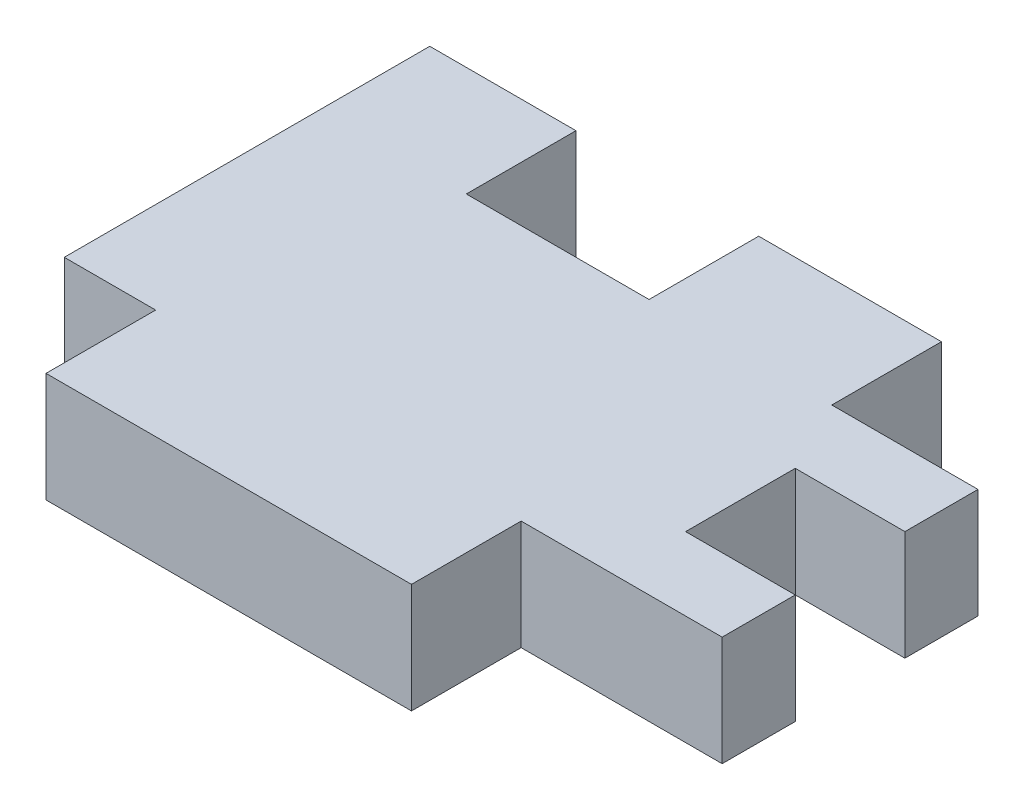
ISO-10303-21;
HEADER;
FILE_DESCRIPTION(('STEP AP214'),'2;1');
FILE_NAME('part.step','',(''),(''),'','','');
FILE_SCHEMA(('AUTOMOTIVE_DESIGN { 1 0 10303 214 1 1 1 1 }'));
ENDSEC;
DATA;
#1=APPLICATION_CONTEXT('core data for automotive mechanical design processes');
#2=APPLICATION_PROTOCOL_DEFINITION('international standard','automotive_design',2000,#1);
#3=PRODUCT_CONTEXT('',#1,'mechanical');
#4=PRODUCT('Part','Part','',(#3));
#5=PRODUCT_RELATED_PRODUCT_CATEGORY('part','',(#4));
#6=PRODUCT_DEFINITION_FORMATION('','',#4);
#7=PRODUCT_DEFINITION_CONTEXT('part definition',#1,'design');
#8=PRODUCT_DEFINITION('design','',#6,#7);
#9=PRODUCT_DEFINITION_SHAPE('','',#8);
#10=(LENGTH_UNIT() NAMED_UNIT(*) SI_UNIT(.MILLI.,.METRE.));
#11=(NAMED_UNIT(*) PLANE_ANGLE_UNIT() SI_UNIT($,.RADIAN.));
#12=(NAMED_UNIT(*) SI_UNIT($,.STERADIAN.) SOLID_ANGLE_UNIT());
#13=UNCERTAINTY_MEASURE_WITH_UNIT(LENGTH_MEASURE(1.E-05),#10,'distance_accuracy_value','');
#14=(GEOMETRIC_REPRESENTATION_CONTEXT(3) GLOBAL_UNCERTAINTY_ASSIGNED_CONTEXT((#13)) GLOBAL_UNIT_ASSIGNED_CONTEXT((#10,
#11,#12)) REPRESENTATION_CONTEXT('',''));
#15=CARTESIAN_POINT('',(0.,0.,0.));
#16=DIRECTION('',(0.,0.,1.));
#17=DIRECTION('',(1.,0.,0.));
#18=AXIS2_PLACEMENT_3D('',#15,#16,#17);
#19=CARTESIAN_POINT('',(4.,3.,0.));
#20=DIRECTION('',(-1.,0.,0.));
#21=DIRECTION('',(0.,0.,1.));
#22=AXIS2_PLACEMENT_3D('',#19,#20,#21);
#23=PLANE('',#22);
#24=DIRECTION('',(0.,0.,-1.));
#25=VECTOR('',#24,1.);
#26=CARTESIAN_POINT('',(4.,0.,0.));
#27=LINE('',#26,#25);
#28=CARTESIAN_POINT('',(4.,0.,-10.));
#29=VERTEX_POINT('',#28);
#30=CARTESIAN_POINT('',(4.,0.,-13.));
#31=VERTEX_POINT('',#30);
#32=EDGE_CURVE('E194',#29,#31,#27,.T.);
#33=ORIENTED_EDGE('',*,*,#32,.T.);
#34=DIRECTION('',(0.,-1.,0.));
#35=VECTOR('',#34,1.);
#36=CARTESIAN_POINT('',(4.,3.,-13.));
#37=LINE('',#36,#35);
#38=CARTESIAN_POINT('',(4.,3.,-13.));
#39=VERTEX_POINT('',#38);
#40=EDGE_CURVE('E11',#39,#31,#37,.T.);
#41=ORIENTED_EDGE('',*,*,#40,.F.);
#42=DIRECTION('',(0.,0.,-1.));
#43=VECTOR('',#42,1.);
#44=CARTESIAN_POINT('',(4.,3.,0.));
#45=LINE('',#44,#43);
#46=CARTESIAN_POINT('',(4.,3.,-10.));
#47=VERTEX_POINT('',#46);
#48=EDGE_CURVE('E341',#47,#39,#45,.T.);
#49=ORIENTED_EDGE('',*,*,#48,.F.);
#50=DIRECTION('',(0.,-1.,0.));
#51=VECTOR('',#50,1.);
#52=CARTESIAN_POINT('',(4.,3.,-10.));
#53=LINE('',#52,#51);
#54=EDGE_CURVE('E51',#47,#29,#53,.T.);
#55=ORIENTED_EDGE('',*,*,#54,.T.);
#56=EDGE_LOOP('',(#33,#41,#49,#55));
#57=FACE_BOUND('',#56,.T.);
#58=ADVANCED_FACE('F35',(#57),#23,.F.);
#59=CARTESIAN_POINT('',(0.,3.,-13.));
#60=DIRECTION('',(0.,0.,1.));
#61=DIRECTION('',(1.,0.,0.));
#62=AXIS2_PLACEMENT_3D('',#59,#60,#61);
#63=PLANE('',#62);
#64=DIRECTION('',(-1.,0.,0.));
#65=VECTOR('',#64,1.);
#66=CARTESIAN_POINT('',(0.,0.,-13.));
#67=LINE('',#66,#65);
#68=CARTESIAN_POINT('',(0.,0.,-13.));
#69=VERTEX_POINT('',#68);
#70=EDGE_CURVE('E196',#31,#69,#67,.T.);
#71=ORIENTED_EDGE('',*,*,#70,.T.);
#72=DIRECTION('',(0.,-1.,0.));
#73=VECTOR('',#72,1.);
#74=CARTESIAN_POINT('',(0.,3.,-13.));
#75=LINE('',#74,#73);
#76=CARTESIAN_POINT('',(0.,3.,-13.));
#77=VERTEX_POINT('',#76);
#78=EDGE_CURVE('E43',#77,#69,#75,.T.);
#79=ORIENTED_EDGE('',*,*,#78,.F.);
#80=DIRECTION('',(-1.,0.,0.));
#81=VECTOR('',#80,1.);
#82=CARTESIAN_POINT('',(0.,3.,-13.));
#83=LINE('',#82,#81);
#84=EDGE_CURVE('E120',#39,#77,#83,.T.);
#85=ORIENTED_EDGE('',*,*,#84,.F.);
#86=ORIENTED_EDGE('',*,*,#40,.T.);
#87=EDGE_LOOP('',(#71,#79,#85,#86));
#88=FACE_BOUND('',#87,.T.);
#89=ADVANCED_FACE('F335',(#88),#63,.F.);
#90=CARTESIAN_POINT('',(0.,3.,0.));
#91=DIRECTION('',(1.,0.,0.));
#92=DIRECTION('',(0.,0.,-1.));
#93=AXIS2_PLACEMENT_3D('',#90,#91,#92);
#94=PLANE('',#93);
#95=DIRECTION('',(0.,0.,1.));
#96=VECTOR('',#95,1.);
#97=CARTESIAN_POINT('',(0.,0.,0.));
#98=LINE('',#97,#96);
#99=CARTESIAN_POINT('',(0.,0.,-3.));
#100=VERTEX_POINT('',#99);
#101=EDGE_CURVE('E198',#69,#100,#98,.T.);
#102=ORIENTED_EDGE('',*,*,#101,.T.);
#103=DIRECTION('',(0.,-1.,0.));
#104=VECTOR('',#103,1.);
#105=CARTESIAN_POINT('',(0.,3.,-3.));
#106=LINE('',#105,#104);
#107=CARTESIAN_POINT('',(0.,3.,-3.));
#108=VERTEX_POINT('',#107);
#109=EDGE_CURVE('E265',#108,#100,#106,.T.);
#110=ORIENTED_EDGE('',*,*,#109,.F.);
#111=DIRECTION('',(0.,0.,1.));
#112=VECTOR('',#111,1.);
#113=CARTESIAN_POINT('',(0.,3.,0.));
#114=LINE('',#113,#112);
#115=EDGE_CURVE('E272',#77,#108,#114,.T.);
#116=ORIENTED_EDGE('',*,*,#115,.F.);
#117=ORIENTED_EDGE('',*,*,#78,.T.);
#118=EDGE_LOOP('',(#102,#110,#116,#117));
#119=FACE_BOUND('',#118,.T.);
#120=ADVANCED_FACE('F270',(#119),#94,.F.);
#121=CARTESIAN_POINT('',(0.,3.,-3.));
#122=DIRECTION('',(0.,0.,1.));
#123=DIRECTION('',(1.,0.,0.));
#124=AXIS2_PLACEMENT_3D('',#121,#122,#123);
#125=PLANE('',#124);
#126=DIRECTION('',(-1.,0.,0.));
#127=VECTOR('',#126,1.);
#128=CARTESIAN_POINT('',(0.,0.,-3.));
#129=LINE('',#128,#127);
#130=CARTESIAN_POINT('',(2.5,0.,-3.));
#131=VERTEX_POINT('',#130);
#132=EDGE_CURVE('E201',#131,#100,#129,.T.);
#133=ORIENTED_EDGE('',*,*,#132,.F.);
#134=DIRECTION('',(0.,-1.,0.));
#135=VECTOR('',#134,1.);
#136=CARTESIAN_POINT('',(2.5,3.,-3.));
#137=LINE('',#136,#135);
#138=CARTESIAN_POINT('',(2.5,3.,-3.));
#139=VERTEX_POINT('',#138);
#140=EDGE_CURVE('E263',#139,#131,#137,.T.);
#141=ORIENTED_EDGE('',*,*,#140,.F.);
#142=DIRECTION('',(-1.,0.,0.));
#143=VECTOR('',#142,1.);
#144=CARTESIAN_POINT('',(0.,3.,-3.));
#145=LINE('',#144,#143);
#146=EDGE_CURVE('E282',#139,#108,#145,.T.);
#147=ORIENTED_EDGE('',*,*,#146,.T.);
#148=ORIENTED_EDGE('',*,*,#109,.T.);
#149=EDGE_LOOP('',(#133,#141,#147,#148));
#150=FACE_BOUND('',#149,.T.);
#151=ADVANCED_FACE('F279',(#150),#125,.T.);
#152=CARTESIAN_POINT('',(2.5,3.,0.));
#153=DIRECTION('',(-1.,0.,0.));
#154=DIRECTION('',(0.,0.,1.));
#155=AXIS2_PLACEMENT_3D('',#152,#153,#154);
#156=PLANE('',#155);
#157=DIRECTION('',(0.,0.,-1.));
#158=VECTOR('',#157,1.);
#159=CARTESIAN_POINT('',(2.5,0.,0.));
#160=LINE('',#159,#158);
#161=CARTESIAN_POINT('',(2.5,0.,0.));
#162=VERTEX_POINT('',#161);
#163=EDGE_CURVE('E204',#162,#131,#160,.T.);
#164=ORIENTED_EDGE('',*,*,#163,.F.);
#165=DIRECTION('',(0.,-1.,0.));
#166=VECTOR('',#165,1.);
#167=CARTESIAN_POINT('',(2.5,3.,0.));
#168=LINE('',#167,#166);
#169=CARTESIAN_POINT('',(2.5,3.,0.));
#170=VERTEX_POINT('',#169);
#171=EDGE_CURVE('E261',#170,#162,#168,.T.);
#172=ORIENTED_EDGE('',*,*,#171,.F.);
#173=DIRECTION('',(0.,0.,-1.));
#174=VECTOR('',#173,1.);
#175=CARTESIAN_POINT('',(2.5,3.,0.));
#176=LINE('',#175,#174);
#177=EDGE_CURVE('E285',#170,#139,#176,.T.);
#178=ORIENTED_EDGE('',*,*,#177,.T.);
#179=ORIENTED_EDGE('',*,*,#140,.T.);
#180=EDGE_LOOP('',(#164,#172,#178,#179));
#181=FACE_BOUND('',#180,.T.);
#182=ADVANCED_FACE('F468',(#181),#156,.T.);
#183=CARTESIAN_POINT('',(0.,3.,0.));
#184=DIRECTION('',(0.,0.,-1.));
#185=DIRECTION('',(-1.,0.,0.));
#186=AXIS2_PLACEMENT_3D('',#183,#184,#185);
#187=PLANE('',#186);
#188=DIRECTION('',(1.,0.,0.));
#189=VECTOR('',#188,1.);
#190=CARTESIAN_POINT('',(0.,0.,0.));
#191=LINE('',#190,#189);
#192=CARTESIAN_POINT('',(12.5,0.,0.));
#193=VERTEX_POINT('',#192);
#194=EDGE_CURVE('E207',#162,#193,#191,.T.);
#195=ORIENTED_EDGE('',*,*,#194,.T.);
#196=DIRECTION('',(0.,-1.,0.));
#197=VECTOR('',#196,1.);
#198=CARTESIAN_POINT('',(12.5,3.,0.));
#199=LINE('',#198,#197);
#200=CARTESIAN_POINT('',(12.5,3.,0.));
#201=VERTEX_POINT('',#200);
#202=EDGE_CURVE('E258',#201,#193,#199,.T.);
#203=ORIENTED_EDGE('',*,*,#202,.F.);
#204=DIRECTION('',(1.,0.,0.));
#205=VECTOR('',#204,1.);
#206=CARTESIAN_POINT('',(0.,3.,0.));
#207=LINE('',#206,#205);
#208=EDGE_CURVE('E287',#170,#201,#207,.T.);
#209=ORIENTED_EDGE('',*,*,#208,.F.);
#210=ORIENTED_EDGE('',*,*,#171,.T.);
#211=EDGE_LOOP('',(#195,#203,#209,#210));
#212=FACE_BOUND('',#211,.T.);
#213=ADVANCED_FACE('F458',(#212),#187,.F.);
#214=CARTESIAN_POINT('',(12.5,3.,0.));
#215=DIRECTION('',(-1.,0.,0.));
#216=DIRECTION('',(0.,0.,1.));
#217=AXIS2_PLACEMENT_3D('',#214,#215,#216);
#218=PLANE('',#217);
#219=DIRECTION('',(0.,0.,-1.));
#220=VECTOR('',#219,1.);
#221=CARTESIAN_POINT('',(12.5,0.,0.));
#222=LINE('',#221,#220);
#223=CARTESIAN_POINT('',(12.5,0.,-3.));
#224=VERTEX_POINT('',#223);
#225=EDGE_CURVE('E209',#193,#224,#222,.T.);
#226=ORIENTED_EDGE('',*,*,#225,.T.);
#227=DIRECTION('',(0.,-1.,0.));
#228=VECTOR('',#227,1.);
#229=CARTESIAN_POINT('',(12.5,3.,-3.));
#230=LINE('',#229,#228);
#231=CARTESIAN_POINT('',(12.5,3.,-3.));
#232=VERTEX_POINT('',#231);
#233=EDGE_CURVE('E255',#232,#224,#230,.T.);
#234=ORIENTED_EDGE('',*,*,#233,.F.);
#235=DIRECTION('',(0.,0.,-1.));
#236=VECTOR('',#235,1.);
#237=CARTESIAN_POINT('',(12.5,3.,0.));
#238=LINE('',#237,#236);
#239=EDGE_CURVE('E293',#201,#232,#238,.T.);
#240=ORIENTED_EDGE('',*,*,#239,.F.);
#241=ORIENTED_EDGE('',*,*,#202,.T.);
#242=EDGE_LOOP('',(#226,#234,#240,#241));
#243=FACE_BOUND('',#242,.T.);
#244=ADVANCED_FACE('F448',(#243),#218,.F.);
#245=CARTESIAN_POINT('',(0.,3.,-3.));
#246=DIRECTION('',(0.,0.,-1.));
#247=DIRECTION('',(-1.,0.,0.));
#248=AXIS2_PLACEMENT_3D('',#245,#246,#247);
#249=PLANE('',#248);
#250=DIRECTION('',(1.,0.,0.));
#251=VECTOR('',#250,1.);
#252=CARTESIAN_POINT('',(0.,0.,-3.));
#253=LINE('',#252,#251);
#254=CARTESIAN_POINT('',(18.,0.,-3.));
#255=VERTEX_POINT('',#254);
#256=EDGE_CURVE('E211',#224,#255,#253,.T.);
#257=ORIENTED_EDGE('',*,*,#256,.T.);
#258=DIRECTION('',(0.,-1.,0.));
#259=VECTOR('',#258,1.);
#260=CARTESIAN_POINT('',(18.,3.,-3.));
#261=LINE('',#260,#259);
#262=CARTESIAN_POINT('',(18.,3.,-3.));
#263=VERTEX_POINT('',#262);
#264=EDGE_CURVE('E252',#263,#255,#261,.T.);
#265=ORIENTED_EDGE('',*,*,#264,.F.);
#266=DIRECTION('',(1.,0.,0.));
#267=VECTOR('',#266,1.);
#268=CARTESIAN_POINT('',(0.,3.,-3.));
#269=LINE('',#268,#267);
#270=EDGE_CURVE('E295',#232,#263,#269,.T.);
#271=ORIENTED_EDGE('',*,*,#270,.F.);
#272=ORIENTED_EDGE('',*,*,#233,.T.);
#273=EDGE_LOOP('',(#257,#265,#271,#272));
#274=FACE_BOUND('',#273,.T.);
#275=ADVANCED_FACE('F438',(#274),#249,.F.);
#276=CARTESIAN_POINT('',(18.,3.,0.));
#277=DIRECTION('',(-1.,0.,0.));
#278=DIRECTION('',(0.,0.,1.));
#279=AXIS2_PLACEMENT_3D('',#276,#277,#278);
#280=PLANE('',#279);
#281=DIRECTION('',(0.,0.,-1.));
#282=VECTOR('',#281,1.);
#283=CARTESIAN_POINT('',(18.,0.,0.));
#284=LINE('',#283,#282);
#285=CARTESIAN_POINT('',(18.,0.,-5.));
#286=VERTEX_POINT('',#285);
#287=EDGE_CURVE('E213',#255,#286,#284,.T.);
#288=ORIENTED_EDGE('',*,*,#287,.T.);
#289=DIRECTION('',(0.,-1.,0.));
#290=VECTOR('',#289,1.);
#291=CARTESIAN_POINT('',(18.,3.,-5.));
#292=LINE('',#291,#290);
#293=CARTESIAN_POINT('',(18.,3.,-5.));
#294=VERTEX_POINT('',#293);
#295=EDGE_CURVE('E250',#294,#286,#292,.T.);
#296=ORIENTED_EDGE('',*,*,#295,.F.);
#297=DIRECTION('',(0.,0.,-1.));
#298=VECTOR('',#297,1.);
#299=CARTESIAN_POINT('',(18.,3.,0.));
#300=LINE('',#299,#298);
#301=EDGE_CURVE('E297',#263,#294,#300,.T.);
#302=ORIENTED_EDGE('',*,*,#301,.F.);
#303=ORIENTED_EDGE('',*,*,#264,.T.);
#304=EDGE_LOOP('',(#288,#296,#302,#303));
#305=FACE_BOUND('',#304,.T.);
#306=ADVANCED_FACE('F428',(#305),#280,.F.);
#307=CARTESIAN_POINT('',(0.,3.,-5.));
#308=DIRECTION('',(0.,0.,-1.));
#309=DIRECTION('',(-1.,0.,0.));
#310=AXIS2_PLACEMENT_3D('',#307,#308,#309);
#311=PLANE('',#310);
#312=DIRECTION('',(1.,0.,0.));
#313=VECTOR('',#312,1.);
#314=CARTESIAN_POINT('',(0.,0.,-5.));
#315=LINE('',#314,#313);
#316=CARTESIAN_POINT('',(15.,0.,-5.));
#317=VERTEX_POINT('',#316);
#318=EDGE_CURVE('E216',#317,#286,#315,.T.);
#319=ORIENTED_EDGE('',*,*,#318,.F.);
#320=DIRECTION('',(0.,-1.,0.));
#321=VECTOR('',#320,1.);
#322=CARTESIAN_POINT('',(15.,3.,-5.));
#323=LINE('',#322,#321);
#324=CARTESIAN_POINT('',(15.,3.,-5.));
#325=VERTEX_POINT('',#324);
#326=EDGE_CURVE('E248',#325,#317,#323,.T.);
#327=ORIENTED_EDGE('',*,*,#326,.F.);
#328=DIRECTION('',(1.,0.,0.));
#329=VECTOR('',#328,1.);
#330=CARTESIAN_POINT('',(0.,3.,-5.));
#331=LINE('',#330,#329);
#332=EDGE_CURVE('E299',#325,#294,#331,.T.);
#333=ORIENTED_EDGE('',*,*,#332,.T.);
#334=ORIENTED_EDGE('',*,*,#295,.T.);
#335=EDGE_LOOP('',(#319,#327,#333,#334));
#336=FACE_BOUND('',#335,.T.);
#337=ADVANCED_FACE('F417',(#336),#311,.T.);
#338=CARTESIAN_POINT('',(15.,3.,0.));
#339=DIRECTION('',(1.,0.,0.));
#340=DIRECTION('',(0.,0.,-1.));
#341=AXIS2_PLACEMENT_3D('',#338,#339,#340);
#342=PLANE('',#341);
#343=DIRECTION('',(0.,0.,1.));
#344=VECTOR('',#343,1.);
#345=CARTESIAN_POINT('',(15.,0.,0.));
#346=LINE('',#345,#344);
#347=CARTESIAN_POINT('',(15.,0.,-8.));
#348=VERTEX_POINT('',#347);
#349=EDGE_CURVE('E219',#348,#317,#346,.T.);
#350=ORIENTED_EDGE('',*,*,#349,.F.);
#351=DIRECTION('',(0.,-1.,0.));
#352=VECTOR('',#351,1.);
#353=CARTESIAN_POINT('',(15.,3.,-8.));
#354=LINE('',#353,#352);
#355=CARTESIAN_POINT('',(15.,3.,-8.));
#356=VERTEX_POINT('',#355);
#357=EDGE_CURVE('E246',#356,#348,#354,.T.);
#358=ORIENTED_EDGE('',*,*,#357,.F.);
#359=DIRECTION('',(0.,0.,1.));
#360=VECTOR('',#359,1.);
#361=CARTESIAN_POINT('',(15.,3.,0.));
#362=LINE('',#361,#360);
#363=EDGE_CURVE('E302',#356,#325,#362,.T.);
#364=ORIENTED_EDGE('',*,*,#363,.T.);
#365=ORIENTED_EDGE('',*,*,#326,.T.);
#366=EDGE_LOOP('',(#350,#358,#364,#365));
#367=FACE_BOUND('',#366,.T.);
#368=ADVANCED_FACE('F407',(#367),#342,.T.);
#369=CARTESIAN_POINT('',(0.,3.,-8.00000000000001));
#370=DIRECTION('',(0.,0.,-1.));
#371=DIRECTION('',(-1.,0.,0.));
#372=AXIS2_PLACEMENT_3D('',#369,#370,#371);
#373=PLANE('',#372);
#374=DIRECTION('',(1.,0.,0.));
#375=VECTOR('',#374,1.);
#376=CARTESIAN_POINT('',(0.,0.,-8.00000000000001));
#377=LINE('',#376,#375);
#378=CARTESIAN_POINT('',(18.,0.,-8.));
#379=VERTEX_POINT('',#378);
#380=EDGE_CURVE('E222',#348,#379,#377,.T.);
#381=ORIENTED_EDGE('',*,*,#380,.T.);
#382=DIRECTION('',(0.,-1.,0.));
#383=VECTOR('',#382,1.);
#384=CARTESIAN_POINT('',(18.,3.,-8.));
#385=LINE('',#384,#383);
#386=CARTESIAN_POINT('',(18.,3.,-8.));
#387=VERTEX_POINT('',#386);
#388=EDGE_CURVE('E243',#387,#379,#385,.T.);
#389=ORIENTED_EDGE('',*,*,#388,.F.);
#390=DIRECTION('',(1.,0.,0.));
#391=VECTOR('',#390,1.);
#392=CARTESIAN_POINT('',(0.,3.,-8.00000000000001));
#393=LINE('',#392,#391);
#394=EDGE_CURVE('E305',#356,#387,#393,.T.);
#395=ORIENTED_EDGE('',*,*,#394,.F.);
#396=ORIENTED_EDGE('',*,*,#357,.T.);
#397=EDGE_LOOP('',(#381,#389,#395,#396));
#398=FACE_BOUND('',#397,.T.);
#399=ADVANCED_FACE('F398',(#398),#373,.F.);
#400=CARTESIAN_POINT('',(18.,3.,0.));
#401=DIRECTION('',(-1.,0.,0.));
#402=DIRECTION('',(0.,0.,1.));
#403=AXIS2_PLACEMENT_3D('',#400,#401,#402);
#404=PLANE('',#403);
#405=DIRECTION('',(0.,0.,-1.));
#406=VECTOR('',#405,1.);
#407=CARTESIAN_POINT('',(18.,0.,0.));
#408=LINE('',#407,#406);
#409=CARTESIAN_POINT('',(18.,0.,-10.));
#410=VERTEX_POINT('',#409);
#411=EDGE_CURVE('E224',#379,#410,#408,.T.);
#412=ORIENTED_EDGE('',*,*,#411,.T.);
#413=DIRECTION('',(0.,-1.,0.));
#414=VECTOR('',#413,1.);
#415=CARTESIAN_POINT('',(18.,3.,-10.));
#416=LINE('',#415,#414);
#417=CARTESIAN_POINT('',(18.,3.,-10.));
#418=VERTEX_POINT('',#417);
#419=EDGE_CURVE('E241',#418,#410,#416,.T.);
#420=ORIENTED_EDGE('',*,*,#419,.F.);
#421=DIRECTION('',(0.,0.,-1.));
#422=VECTOR('',#421,1.);
#423=CARTESIAN_POINT('',(18.,3.,0.));
#424=LINE('',#423,#422);
#425=EDGE_CURVE('E307',#387,#418,#424,.T.);
#426=ORIENTED_EDGE('',*,*,#425,.F.);
#427=ORIENTED_EDGE('',*,*,#388,.T.);
#428=EDGE_LOOP('',(#412,#420,#426,#427));
#429=FACE_BOUND('',#428,.T.);
#430=ADVANCED_FACE('F318',(#429),#404,.F.);
#431=CARTESIAN_POINT('',(0.,3.,-10.));
#432=DIRECTION('',(0.,0.,-1.));
#433=DIRECTION('',(-1.,0.,0.));
#434=AXIS2_PLACEMENT_3D('',#431,#432,#433);
#435=PLANE('',#434);
#436=DIRECTION('',(1.,0.,0.));
#437=VECTOR('',#436,1.);
#438=CARTESIAN_POINT('',(0.,0.,-10.));
#439=LINE('',#438,#437);
#440=CARTESIAN_POINT('',(14.,0.,-10.));
#441=VERTEX_POINT('',#440);
#442=EDGE_CURVE('E227',#441,#410,#439,.T.);
#443=ORIENTED_EDGE('',*,*,#442,.F.);
#444=DIRECTION('',(0.,-1.,0.));
#445=VECTOR('',#444,1.);
#446=CARTESIAN_POINT('',(14.,3.,-10.));
#447=LINE('',#446,#445);
#448=CARTESIAN_POINT('',(14.,3.,-10.));
#449=VERTEX_POINT('',#448);
#450=EDGE_CURVE('E239',#449,#441,#447,.T.);
#451=ORIENTED_EDGE('',*,*,#450,.F.);
#452=DIRECTION('',(1.,0.,0.));
#453=VECTOR('',#452,1.);
#454=CARTESIAN_POINT('',(0.,3.,-10.));
#455=LINE('',#454,#453);
#456=EDGE_CURVE('E191',#449,#418,#455,.T.);
#457=ORIENTED_EDGE('',*,*,#456,.T.);
#458=ORIENTED_EDGE('',*,*,#419,.T.);
#459=EDGE_LOOP('',(#443,#451,#457,#458));
#460=FACE_BOUND('',#459,.T.);
#461=ADVANCED_FACE('F311',(#460),#435,.T.);
#462=CARTESIAN_POINT('',(14.,3.,0.));
#463=DIRECTION('',(-1.,0.,0.));
#464=DIRECTION('',(0.,0.,1.));
#465=AXIS2_PLACEMENT_3D('',#462,#463,#464);
#466=PLANE('',#465);
#467=DIRECTION('',(0.,0.,-1.));
#468=VECTOR('',#467,1.);
#469=CARTESIAN_POINT('',(14.,0.,0.));
#470=LINE('',#469,#468);
#471=CARTESIAN_POINT('',(14.,0.,-13.));
#472=VERTEX_POINT('',#471);
#473=EDGE_CURVE('E230',#441,#472,#470,.T.);
#474=ORIENTED_EDGE('',*,*,#473,.T.);
#475=DIRECTION('',(0.,-1.,0.));
#476=VECTOR('',#475,1.);
#477=CARTESIAN_POINT('',(14.,3.,-13.));
#478=LINE('',#477,#476);
#479=CARTESIAN_POINT('',(14.,3.,-13.));
#480=VERTEX_POINT('',#479);
#481=EDGE_CURVE('E185',#480,#472,#478,.T.);
#482=ORIENTED_EDGE('',*,*,#481,.F.);
#483=DIRECTION('',(0.,0.,-1.));
#484=VECTOR('',#483,1.);
#485=CARTESIAN_POINT('',(14.,3.,0.));
#486=LINE('',#485,#484);
#487=EDGE_CURVE('E173',#449,#480,#486,.T.);
#488=ORIENTED_EDGE('',*,*,#487,.F.);
#489=ORIENTED_EDGE('',*,*,#450,.T.);
#490=EDGE_LOOP('',(#474,#482,#488,#489));
#491=FACE_BOUND('',#490,.T.);
#492=ADVANCED_FACE('F323',(#491),#466,.F.);
#493=CARTESIAN_POINT('',(0.,3.,-13.));
#494=DIRECTION('',(0.,0.,1.));
#495=DIRECTION('',(1.,0.,0.));
#496=AXIS2_PLACEMENT_3D('',#493,#494,#495);
#497=PLANE('',#496);
#498=DIRECTION('',(-1.,0.,0.));
#499=VECTOR('',#498,1.);
#500=CARTESIAN_POINT('',(0.,0.,-13.));
#501=LINE('',#500,#499);
#502=CARTESIAN_POINT('',(9.,0.,-13.));
#503=VERTEX_POINT('',#502);
#504=EDGE_CURVE('E182',#472,#503,#501,.T.);
#505=ORIENTED_EDGE('',*,*,#504,.T.);
#506=DIRECTION('',(0.,-1.,0.));
#507=VECTOR('',#506,1.);
#508=CARTESIAN_POINT('',(9.,3.,-13.));
#509=LINE('',#508,#507);
#510=CARTESIAN_POINT('',(9.,3.,-13.));
#511=VERTEX_POINT('',#510);
#512=EDGE_CURVE('E179',#511,#503,#509,.T.);
#513=ORIENTED_EDGE('',*,*,#512,.F.);
#514=DIRECTION('',(-1.,0.,0.));
#515=VECTOR('',#514,1.);
#516=CARTESIAN_POINT('',(0.,3.,-13.));
#517=LINE('',#516,#515);
#518=EDGE_CURVE('E165',#480,#511,#517,.T.);
#519=ORIENTED_EDGE('',*,*,#518,.F.);
#520=ORIENTED_EDGE('',*,*,#481,.T.);
#521=EDGE_LOOP('',(#505,#513,#519,#520));
#522=FACE_BOUND('',#521,.T.);
#523=ADVANCED_FACE('F180',(#522),#497,.F.);
#524=CARTESIAN_POINT('',(9.,3.,0.));
#525=DIRECTION('',(1.,0.,0.));
#526=DIRECTION('',(0.,0.,-1.));
#527=AXIS2_PLACEMENT_3D('',#524,#525,#526);
#528=PLANE('',#527);
#529=DIRECTION('',(0.,0.,1.));
#530=VECTOR('',#529,1.);
#531=CARTESIAN_POINT('',(9.,0.,0.));
#532=LINE('',#531,#530);
#533=CARTESIAN_POINT('',(9.,0.,-10.));
#534=VERTEX_POINT('',#533);
#535=EDGE_CURVE('E234',#503,#534,#532,.T.);
#536=ORIENTED_EDGE('',*,*,#535,.T.);
#537=DIRECTION('',(0.,-1.,0.));
#538=VECTOR('',#537,1.);
#539=CARTESIAN_POINT('',(9.,3.,-10.));
#540=LINE('',#539,#538);
#541=CARTESIAN_POINT('',(9.,3.,-10.));
#542=VERTEX_POINT('',#541);
#543=EDGE_CURVE('E108',#542,#534,#540,.T.);
#544=ORIENTED_EDGE('',*,*,#543,.F.);
#545=DIRECTION('',(0.,0.,1.));
#546=VECTOR('',#545,1.);
#547=CARTESIAN_POINT('',(9.,3.,0.));
#548=LINE('',#547,#546);
#549=EDGE_CURVE('E170',#511,#542,#548,.T.);
#550=ORIENTED_EDGE('',*,*,#549,.F.);
#551=ORIENTED_EDGE('',*,*,#512,.T.);
#552=EDGE_LOOP('',(#536,#544,#550,#551));
#553=FACE_BOUND('',#552,.T.);
#554=ADVANCED_FACE('F187',(#553),#528,.F.);
#555=EDGE_CURVE('E231',#29,#534,#439,.T.);
#556=ORIENTED_EDGE('',*,*,#555,.F.);
#557=ORIENTED_EDGE('',*,*,#54,.F.);
#558=EDGE_CURVE('E188',#47,#542,#455,.T.);
#559=ORIENTED_EDGE('',*,*,#558,.T.);
#560=ORIENTED_EDGE('',*,*,#543,.T.);
#561=EDGE_LOOP('',(#556,#557,#559,#560));
#562=FACE_BOUND('',#561,.T.);
#563=ADVANCED_FACE('F332',(#562),#435,.T.);
#564=CARTESIAN_POINT('',(0.,3.,0.));
#565=DIRECTION('',(0.,1.,0.));
#566=DIRECTION('',(0.,0.,1.));
#567=AXIS2_PLACEMENT_3D('',#564,#565,#566);
#568=PLANE('',#567);
#569=ORIENTED_EDGE('',*,*,#48,.T.);
#570=ORIENTED_EDGE('',*,*,#84,.T.);
#571=ORIENTED_EDGE('',*,*,#115,.T.);
#572=ORIENTED_EDGE('',*,*,#146,.F.);
#573=ORIENTED_EDGE('',*,*,#177,.F.);
#574=ORIENTED_EDGE('',*,*,#208,.T.);
#575=ORIENTED_EDGE('',*,*,#239,.T.);
#576=ORIENTED_EDGE('',*,*,#270,.T.);
#577=ORIENTED_EDGE('',*,*,#301,.T.);
#578=ORIENTED_EDGE('',*,*,#332,.F.);
#579=ORIENTED_EDGE('',*,*,#363,.F.);
#580=ORIENTED_EDGE('',*,*,#394,.T.);
#581=ORIENTED_EDGE('',*,*,#425,.T.);
#582=ORIENTED_EDGE('',*,*,#456,.F.);
#583=ORIENTED_EDGE('',*,*,#487,.T.);
#584=ORIENTED_EDGE('',*,*,#518,.T.);
#585=ORIENTED_EDGE('',*,*,#549,.T.);
#586=ORIENTED_EDGE('',*,*,#558,.F.);
#587=EDGE_LOOP('',(#569,#570,#571,#572,#573,#574,#575,#576,#577,#578,#579,#580,#581,#582,#583,
#584,#585,#586));
#588=FACE_BOUND('',#587,.T.);
#589=ADVANCED_FACE('F167',(#588),#568,.T.);
#590=CARTESIAN_POINT('',(0.,0.,0.));
#591=DIRECTION('',(0.,1.,0.));
#592=DIRECTION('',(0.,0.,1.));
#593=AXIS2_PLACEMENT_3D('',#590,#591,#592);
#594=PLANE('',#593);
#595=ORIENTED_EDGE('',*,*,#32,.F.);
#596=ORIENTED_EDGE('',*,*,#555,.T.);
#597=ORIENTED_EDGE('',*,*,#535,.F.);
#598=ORIENTED_EDGE('',*,*,#504,.F.);
#599=ORIENTED_EDGE('',*,*,#473,.F.);
#600=ORIENTED_EDGE('',*,*,#442,.T.);
#601=ORIENTED_EDGE('',*,*,#411,.F.);
#602=ORIENTED_EDGE('',*,*,#380,.F.);
#603=ORIENTED_EDGE('',*,*,#349,.T.);
#604=ORIENTED_EDGE('',*,*,#318,.T.);
#605=ORIENTED_EDGE('',*,*,#287,.F.);
#606=ORIENTED_EDGE('',*,*,#256,.F.);
#607=ORIENTED_EDGE('',*,*,#225,.F.);
#608=ORIENTED_EDGE('',*,*,#194,.F.);
#609=ORIENTED_EDGE('',*,*,#163,.T.);
#610=ORIENTED_EDGE('',*,*,#132,.T.);
#611=ORIENTED_EDGE('',*,*,#101,.F.);
#612=ORIENTED_EDGE('',*,*,#70,.F.);
#613=EDGE_LOOP('',(#595,#596,#597,#598,#599,#600,#601,#602,#603,#604,#605,#606,#607,#608,#609,
#610,#611,#612));
#614=FACE_BOUND('',#613,.T.);
#615=ADVANCED_FACE('F274',(#614),#594,.F.);
#616=CLOSED_SHELL('',(#58,#89,#120,#151,#182,#213,#244,#275,#306,#337,#368,#399,#430,#461,#492,
#523,#554,#563,#589,#615));
#617=MANIFOLD_SOLID_BREP('B2',#616);
#618=ADVANCED_BREP_SHAPE_REPRESENTATION('',(#18,#617),#14);
#619=SHAPE_DEFINITION_REPRESENTATION(#9,#618);
ENDSEC;
END-ISO-10303-21;
